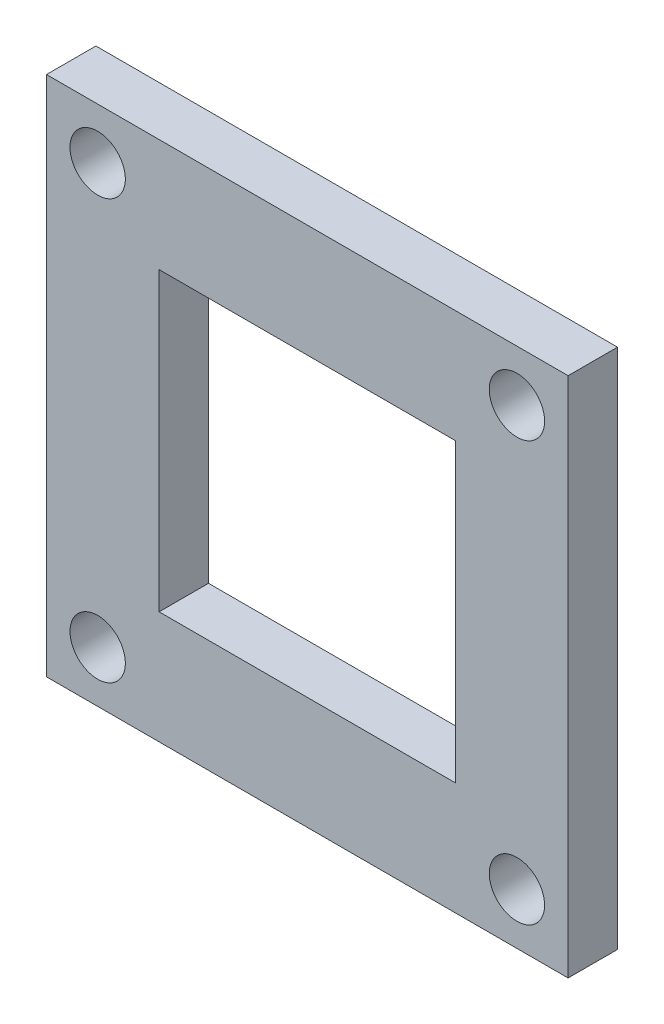
ISO-10303-21;
HEADER;
FILE_DESCRIPTION(('STEP AP214'),'2;1');
FILE_NAME('part.step','',(''),(''),'','','');
FILE_SCHEMA(('AUTOMOTIVE_DESIGN { 1 0 10303 214 1 1 1 1 }'));
ENDSEC;
DATA;
#1=APPLICATION_CONTEXT('core data for automotive mechanical design processes');
#2=APPLICATION_PROTOCOL_DEFINITION('international standard','automotive_design',2000,#1);
#3=PRODUCT_CONTEXT('',#1,'mechanical');
#4=PRODUCT('Part','Part','',(#3));
#5=PRODUCT_RELATED_PRODUCT_CATEGORY('part','',(#4));
#6=PRODUCT_DEFINITION_FORMATION('','',#4);
#7=PRODUCT_DEFINITION_CONTEXT('part definition',#1,'design');
#8=PRODUCT_DEFINITION('design','',#6,#7);
#9=PRODUCT_DEFINITION_SHAPE('','',#8);
#10=(LENGTH_UNIT() NAMED_UNIT(*) SI_UNIT(.MILLI.,.METRE.));
#11=(NAMED_UNIT(*) PLANE_ANGLE_UNIT() SI_UNIT($,.RADIAN.));
#12=(NAMED_UNIT(*) SI_UNIT($,.STERADIAN.) SOLID_ANGLE_UNIT());
#13=UNCERTAINTY_MEASURE_WITH_UNIT(LENGTH_MEASURE(1.E-05),#10,'distance_accuracy_value','');
#14=(GEOMETRIC_REPRESENTATION_CONTEXT(3) GLOBAL_UNCERTAINTY_ASSIGNED_CONTEXT((#13)) GLOBAL_UNIT_ASSIGNED_CONTEXT((#10,
#11,#12)) REPRESENTATION_CONTEXT('',''));
#15=CARTESIAN_POINT('',(0.,0.,0.));
#16=DIRECTION('',(0.,0.,1.));
#17=DIRECTION('',(1.,0.,0.));
#18=AXIS2_PLACEMENT_3D('',#15,#16,#17);
#19=CARTESIAN_POINT('',(0.,0.,3.175));
#20=DIRECTION('',(1.,0.,0.));
#21=DIRECTION('',(0.,0.,-1.));
#22=AXIS2_PLACEMENT_3D('',#19,#20,#21);
#23=PLANE('',#22);
#24=DIRECTION('',(0.,-1.,0.));
#25=VECTOR('',#24,1.);
#26=CARTESIAN_POINT('',(0.,0.,0.));
#27=LINE('',#26,#25);
#28=CARTESIAN_POINT('',(0.,33.528,0.));
#29=VERTEX_POINT('',#28);
#30=CARTESIAN_POINT('',(0.,0.,0.));
#31=VERTEX_POINT('',#30);
#32=EDGE_CURVE('E134',#29,#31,#27,.T.);
#33=ORIENTED_EDGE('',*,*,#32,.T.);
#34=DIRECTION('',(0.,0.,-1.));
#35=VECTOR('',#34,1.);
#36=CARTESIAN_POINT('',(0.,0.,3.175));
#37=LINE('',#36,#35);
#38=CARTESIAN_POINT('',(0.,0.,3.175));
#39=VERTEX_POINT('',#38);
#40=EDGE_CURVE('E11',#39,#31,#37,.T.);
#41=ORIENTED_EDGE('',*,*,#40,.F.);
#42=DIRECTION('',(0.,-1.,0.));
#43=VECTOR('',#42,1.);
#44=CARTESIAN_POINT('',(0.,0.,3.175));
#45=LINE('',#44,#43);
#46=CARTESIAN_POINT('',(0.,33.528,3.175));
#47=VERTEX_POINT('',#46);
#48=EDGE_CURVE('E138',#47,#39,#45,.T.);
#49=ORIENTED_EDGE('',*,*,#48,.F.);
#50=DIRECTION('',(0.,0.,-1.));
#51=VECTOR('',#50,1.);
#52=CARTESIAN_POINT('',(0.,33.528,3.175));
#53=LINE('',#52,#51);
#54=EDGE_CURVE('E148',#47,#29,#53,.T.);
#55=ORIENTED_EDGE('',*,*,#54,.T.);
#56=EDGE_LOOP('',(#33,#41,#49,#55));
#57=FACE_BOUND('',#56,.T.);
#58=ADVANCED_FACE('F33',(#57),#23,.F.);
#59=CARTESIAN_POINT('',(0.,0.,3.175));
#60=DIRECTION('',(0.,1.,0.));
#61=DIRECTION('',(0.,0.,1.));
#62=AXIS2_PLACEMENT_3D('',#59,#60,#61);
#63=PLANE('',#62);
#64=DIRECTION('',(1.,0.,0.));
#65=VECTOR('',#64,1.);
#66=CARTESIAN_POINT('',(0.,0.,0.));
#67=LINE('',#66,#65);
#68=CARTESIAN_POINT('',(33.528,0.,0.));
#69=VERTEX_POINT('',#68);
#70=EDGE_CURVE('E151',#31,#69,#67,.T.);
#71=ORIENTED_EDGE('',*,*,#70,.T.);
#72=DIRECTION('',(0.,0.,-1.));
#73=VECTOR('',#72,1.);
#74=CARTESIAN_POINT('',(33.528,0.,3.175));
#75=LINE('',#74,#73);
#76=CARTESIAN_POINT('',(33.528,0.,3.175));
#77=VERTEX_POINT('',#76);
#78=EDGE_CURVE('E40',#77,#69,#75,.T.);
#79=ORIENTED_EDGE('',*,*,#78,.F.);
#80=DIRECTION('',(1.,0.,0.));
#81=VECTOR('',#80,1.);
#82=CARTESIAN_POINT('',(0.,0.,3.175));
#83=LINE('',#82,#81);
#84=EDGE_CURVE('E141',#39,#77,#83,.T.);
#85=ORIENTED_EDGE('',*,*,#84,.F.);
#86=ORIENTED_EDGE('',*,*,#40,.T.);
#87=EDGE_LOOP('',(#71,#79,#85,#86));
#88=FACE_BOUND('',#87,.T.);
#89=ADVANCED_FACE('F179',(#88),#63,.F.);
#90=CARTESIAN_POINT('',(33.528,0.,3.175));
#91=DIRECTION('',(-1.,0.,0.));
#92=DIRECTION('',(0.,0.,1.));
#93=AXIS2_PLACEMENT_3D('',#90,#91,#92);
#94=PLANE('',#93);
#95=DIRECTION('',(0.,1.,0.));
#96=VECTOR('',#95,1.);
#97=CARTESIAN_POINT('',(33.528,0.,0.));
#98=LINE('',#97,#96);
#99=CARTESIAN_POINT('',(33.528,33.528,0.));
#100=VERTEX_POINT('',#99);
#101=EDGE_CURVE('E153',#69,#100,#98,.T.);
#102=ORIENTED_EDGE('',*,*,#101,.T.);
#103=DIRECTION('',(0.,0.,-1.));
#104=VECTOR('',#103,1.);
#105=CARTESIAN_POINT('',(33.528,33.528,3.175));
#106=LINE('',#105,#104);
#107=CARTESIAN_POINT('',(33.528,33.528,3.175));
#108=VERTEX_POINT('',#107);
#109=EDGE_CURVE('E158',#108,#100,#106,.T.);
#110=ORIENTED_EDGE('',*,*,#109,.F.);
#111=DIRECTION('',(0.,1.,0.));
#112=VECTOR('',#111,1.);
#113=CARTESIAN_POINT('',(33.528,0.,3.175));
#114=LINE('',#113,#112);
#115=EDGE_CURVE('E144',#77,#108,#114,.T.);
#116=ORIENTED_EDGE('',*,*,#115,.F.);
#117=ORIENTED_EDGE('',*,*,#78,.T.);
#118=EDGE_LOOP('',(#102,#110,#116,#117));
#119=FACE_BOUND('',#118,.T.);
#120=ADVANCED_FACE('F165',(#119),#94,.F.);
#121=CARTESIAN_POINT('',(0.,33.528,3.175));
#122=DIRECTION('',(0.,-1.,0.));
#123=DIRECTION('',(0.,0.,-1.));
#124=AXIS2_PLACEMENT_3D('',#121,#122,#123);
#125=PLANE('',#124);
#126=DIRECTION('',(-1.,0.,0.));
#127=VECTOR('',#126,1.);
#128=CARTESIAN_POINT('',(0.,33.528,0.));
#129=LINE('',#128,#127);
#130=EDGE_CURVE('E142',#100,#29,#129,.T.);
#131=ORIENTED_EDGE('',*,*,#130,.T.);
#132=ORIENTED_EDGE('',*,*,#54,.F.);
#133=DIRECTION('',(-1.,0.,0.));
#134=VECTOR('',#133,1.);
#135=CARTESIAN_POINT('',(0.,33.528,3.175));
#136=LINE('',#135,#134);
#137=EDGE_CURVE('E146',#108,#47,#136,.T.);
#138=ORIENTED_EDGE('',*,*,#137,.F.);
#139=ORIENTED_EDGE('',*,*,#109,.T.);
#140=EDGE_LOOP('',(#131,#132,#138,#139));
#141=FACE_BOUND('',#140,.T.);
#142=ADVANCED_FACE('F172',(#141),#125,.F.);
#143=CARTESIAN_POINT('',(0.,0.,3.175));
#144=DIRECTION('',(0.,0.,-1.));
#145=DIRECTION('',(-1.,0.,0.));
#146=AXIS2_PLACEMENT_3D('',#143,#144,#145);
#147=PLANE('',#146);
#148=CARTESIAN_POINT('',(3.2893,30.2387,3.175));
#149=DIRECTION('',(0.,0.,1.));
#150=DIRECTION('',(-1.,0.,0.));
#151=AXIS2_PLACEMENT_3D('',#148,#149,#150);
#152=CIRCLE('',#151,1.77799999999999);
#153=CARTESIAN_POINT('',(1.51130000000001,30.2387,3.175));
#154=VERTEX_POINT('',#153);
#155=EDGE_CURVE('E243',#154,#154,#152,.T.);
#156=ORIENTED_EDGE('',*,*,#155,.F.);
#157=EDGE_LOOP('',(#156));
#158=FACE_BOUND('',#157,.T.);
#159=CARTESIAN_POINT('',(3.2893,3.2893,3.175));
#160=DIRECTION('',(0.,0.,1.));
#161=DIRECTION('',(-1.,0.,0.));
#162=AXIS2_PLACEMENT_3D('',#159,#160,#161);
#163=CIRCLE('',#162,1.778);
#164=CARTESIAN_POINT('',(1.5113,3.2893,3.175));
#165=VERTEX_POINT('',#164);
#166=EDGE_CURVE('E235',#165,#165,#163,.T.);
#167=ORIENTED_EDGE('',*,*,#166,.F.);
#168=EDGE_LOOP('',(#167));
#169=FACE_BOUND('',#168,.T.);
#170=CARTESIAN_POINT('',(30.2387,3.2893,3.175));
#171=DIRECTION('',(0.,0.,1.));
#172=DIRECTION('',(1.,0.,0.));
#173=AXIS2_PLACEMENT_3D('',#170,#171,#172);
#174=CIRCLE('',#173,1.778);
#175=CARTESIAN_POINT('',(32.0167,3.2893,3.175));
#176=VERTEX_POINT('',#175);
#177=EDGE_CURVE('E229',#176,#176,#174,.T.);
#178=ORIENTED_EDGE('',*,*,#177,.F.);
#179=EDGE_LOOP('',(#178));
#180=FACE_BOUND('',#179,.T.);
#181=CARTESIAN_POINT('',(30.2387,30.2387,3.175));
#182=DIRECTION('',(0.,0.,1.));
#183=DIRECTION('',(1.,0.,0.));
#184=AXIS2_PLACEMENT_3D('',#181,#182,#183);
#185=CIRCLE('',#184,1.77799999999999);
#186=CARTESIAN_POINT('',(32.0167,30.2387,3.175));
#187=VERTEX_POINT('',#186);
#188=EDGE_CURVE('E121',#187,#187,#185,.T.);
#189=ORIENTED_EDGE('',*,*,#188,.F.);
#190=EDGE_LOOP('',(#189));
#191=FACE_BOUND('',#190,.T.);
#192=DIRECTION('',(1.,0.,0.));
#193=VECTOR('',#192,1.);
#194=CARTESIAN_POINT('',(7.23900000000001,7.239,3.175));
#195=LINE('',#194,#193);
#196=CARTESIAN_POINT('',(7.23900000000001,7.239,3.175));
#197=VERTEX_POINT('',#196);
#198=CARTESIAN_POINT('',(26.289,7.239,3.175));
#199=VERTEX_POINT('',#198);
#200=EDGE_CURVE('E127',#197,#199,#195,.T.);
#201=ORIENTED_EDGE('',*,*,#200,.F.);
#202=DIRECTION('',(0.,-1.,0.));
#203=VECTOR('',#202,1.);
#204=CARTESIAN_POINT('',(7.239,26.289,3.175));
#205=LINE('',#204,#203);
#206=CARTESIAN_POINT('',(7.239,26.289,3.175));
#207=VERTEX_POINT('',#206);
#208=EDGE_CURVE('E47',#207,#197,#205,.T.);
#209=ORIENTED_EDGE('',*,*,#208,.F.);
#210=DIRECTION('',(-1.,0.,0.));
#211=VECTOR('',#210,1.);
#212=CARTESIAN_POINT('',(7.239,26.289,3.175));
#213=LINE('',#212,#211);
#214=CARTESIAN_POINT('',(26.289,26.289,3.175));
#215=VERTEX_POINT('',#214);
#216=EDGE_CURVE('E115',#215,#207,#213,.T.);
#217=ORIENTED_EDGE('',*,*,#216,.F.);
#218=DIRECTION('',(0.,1.,0.));
#219=VECTOR('',#218,1.);
#220=CARTESIAN_POINT('',(26.289,26.289,3.175));
#221=LINE('',#220,#219);
#222=EDGE_CURVE('E118',#199,#215,#221,.T.);
#223=ORIENTED_EDGE('',*,*,#222,.F.);
#224=EDGE_LOOP('',(#201,#209,#217,#223));
#225=FACE_BOUND('',#224,.T.);
#226=ORIENTED_EDGE('',*,*,#48,.T.);
#227=ORIENTED_EDGE('',*,*,#84,.T.);
#228=ORIENTED_EDGE('',*,*,#115,.T.);
#229=ORIENTED_EDGE('',*,*,#137,.T.);
#230=EDGE_LOOP('',(#226,#227,#228,#229));
#231=FACE_BOUND('',#230,.T.);
#232=ADVANCED_FACE('F178',(#158,#169,#180,#191,#225,#231),#147,.F.);
#233=CARTESIAN_POINT('',(0.,0.,0.));
#234=DIRECTION('',(0.,0.,-1.));
#235=DIRECTION('',(-1.,0.,0.));
#236=AXIS2_PLACEMENT_3D('',#233,#234,#235);
#237=PLANE('',#236);
#238=CARTESIAN_POINT('',(3.2893,30.2387,0.));
#239=DIRECTION('',(0.,0.,1.));
#240=DIRECTION('',(-1.,0.,0.));
#241=AXIS2_PLACEMENT_3D('',#238,#239,#240);
#242=CIRCLE('',#241,1.77799999999999);
#243=CARTESIAN_POINT('',(1.51130000000001,30.2387,0.));
#244=VERTEX_POINT('',#243);
#245=EDGE_CURVE('E240',#244,#244,#242,.T.);
#246=ORIENTED_EDGE('',*,*,#245,.T.);
#247=EDGE_LOOP('',(#246));
#248=FACE_BOUND('',#247,.T.);
#249=CARTESIAN_POINT('',(3.2893,3.2893,0.));
#250=DIRECTION('',(0.,0.,1.));
#251=DIRECTION('',(-1.,0.,0.));
#252=AXIS2_PLACEMENT_3D('',#249,#250,#251);
#253=CIRCLE('',#252,1.778);
#254=CARTESIAN_POINT('',(1.5113,3.2893,0.));
#255=VERTEX_POINT('',#254);
#256=EDGE_CURVE('E231',#255,#255,#253,.T.);
#257=ORIENTED_EDGE('',*,*,#256,.T.);
#258=EDGE_LOOP('',(#257));
#259=FACE_BOUND('',#258,.T.);
#260=CARTESIAN_POINT('',(30.2387,3.2893,0.));
#261=DIRECTION('',(0.,0.,1.));
#262=DIRECTION('',(1.,0.,0.));
#263=AXIS2_PLACEMENT_3D('',#260,#261,#262);
#264=CIRCLE('',#263,1.778);
#265=CARTESIAN_POINT('',(32.0167,3.2893,0.));
#266=VERTEX_POINT('',#265);
#267=EDGE_CURVE('E226',#266,#266,#264,.T.);
#268=ORIENTED_EDGE('',*,*,#267,.T.);
#269=EDGE_LOOP('',(#268));
#270=FACE_BOUND('',#269,.T.);
#271=CARTESIAN_POINT('',(30.2387,30.2387,0.));
#272=DIRECTION('',(0.,0.,1.));
#273=DIRECTION('',(1.,0.,0.));
#274=AXIS2_PLACEMENT_3D('',#271,#272,#273);
#275=CIRCLE('',#274,1.77799999999999);
#276=CARTESIAN_POINT('',(32.0167,30.2387,0.));
#277=VERTEX_POINT('',#276);
#278=EDGE_CURVE('E128',#277,#277,#275,.T.);
#279=ORIENTED_EDGE('',*,*,#278,.T.);
#280=EDGE_LOOP('',(#279));
#281=FACE_BOUND('',#280,.T.);
#282=DIRECTION('',(0.,-1.,0.));
#283=VECTOR('',#282,1.);
#284=CARTESIAN_POINT('',(7.239,26.289,0.));
#285=LINE('',#284,#283);
#286=CARTESIAN_POINT('',(7.239,26.289,0.));
#287=VERTEX_POINT('',#286);
#288=CARTESIAN_POINT('',(7.23900000000001,7.239,0.));
#289=VERTEX_POINT('',#288);
#290=EDGE_CURVE('E99',#287,#289,#285,.T.);
#291=ORIENTED_EDGE('',*,*,#290,.T.);
#292=DIRECTION('',(1.,0.,0.));
#293=VECTOR('',#292,1.);
#294=CARTESIAN_POINT('',(7.23900000000001,7.239,0.));
#295=LINE('',#294,#293);
#296=CARTESIAN_POINT('',(26.289,7.239,0.));
#297=VERTEX_POINT('',#296);
#298=EDGE_CURVE('E108',#289,#297,#295,.T.);
#299=ORIENTED_EDGE('',*,*,#298,.T.);
#300=DIRECTION('',(0.,1.,0.));
#301=VECTOR('',#300,1.);
#302=CARTESIAN_POINT('',(26.289,26.289,0.));
#303=LINE('',#302,#301);
#304=CARTESIAN_POINT('',(26.289,26.289,0.));
#305=VERTEX_POINT('',#304);
#306=EDGE_CURVE('E55',#297,#305,#303,.T.);
#307=ORIENTED_EDGE('',*,*,#306,.T.);
#308=DIRECTION('',(-1.,0.,0.));
#309=VECTOR('',#308,1.);
#310=CARTESIAN_POINT('',(7.239,26.289,0.));
#311=LINE('',#310,#309);
#312=EDGE_CURVE('E105',#305,#287,#311,.T.);
#313=ORIENTED_EDGE('',*,*,#312,.T.);
#314=EDGE_LOOP('',(#291,#299,#307,#313));
#315=FACE_BOUND('',#314,.T.);
#316=ORIENTED_EDGE('',*,*,#32,.F.);
#317=ORIENTED_EDGE('',*,*,#130,.F.);
#318=ORIENTED_EDGE('',*,*,#101,.F.);
#319=ORIENTED_EDGE('',*,*,#70,.F.);
#320=EDGE_LOOP('',(#316,#317,#318,#319));
#321=FACE_BOUND('',#320,.T.);
#322=ADVANCED_FACE('F112',(#248,#259,#270,#281,#315,#321),#237,.T.);
#323=CARTESIAN_POINT('',(7.239,26.289,0.));
#324=DIRECTION('',(-1.,0.,0.));
#325=DIRECTION('',(0.,-1.,0.));
#326=AXIS2_PLACEMENT_3D('',#323,#324,#325);
#327=PLANE('',#326);
#328=ORIENTED_EDGE('',*,*,#208,.T.);
#329=DIRECTION('',(0.,0.,1.));
#330=VECTOR('',#329,1.);
#331=CARTESIAN_POINT('',(7.23900000000001,7.239,0.));
#332=LINE('',#331,#330);
#333=EDGE_CURVE('E95',#289,#197,#332,.T.);
#334=ORIENTED_EDGE('',*,*,#333,.F.);
#335=ORIENTED_EDGE('',*,*,#290,.F.);
#336=DIRECTION('',(0.,0.,1.));
#337=VECTOR('',#336,1.);
#338=CARTESIAN_POINT('',(7.239,26.289,0.));
#339=LINE('',#338,#337);
#340=EDGE_CURVE('E132',#287,#207,#339,.T.);
#341=ORIENTED_EDGE('',*,*,#340,.T.);
#342=EDGE_LOOP('',(#328,#334,#335,#341));
#343=FACE_BOUND('',#342,.T.);
#344=ADVANCED_FACE('F97',(#343),#327,.F.);
#345=CARTESIAN_POINT('',(7.239,26.289,0.));
#346=DIRECTION('',(0.,1.,0.));
#347=DIRECTION('',(0.,0.,1.));
#348=AXIS2_PLACEMENT_3D('',#345,#346,#347);
#349=PLANE('',#348);
#350=ORIENTED_EDGE('',*,*,#216,.T.);
#351=ORIENTED_EDGE('',*,*,#340,.F.);
#352=ORIENTED_EDGE('',*,*,#312,.F.);
#353=DIRECTION('',(0.,0.,1.));
#354=VECTOR('',#353,1.);
#355=CARTESIAN_POINT('',(26.289,26.289,0.));
#356=LINE('',#355,#354);
#357=EDGE_CURVE('E135',#305,#215,#356,.T.);
#358=ORIENTED_EDGE('',*,*,#357,.T.);
#359=EDGE_LOOP('',(#350,#351,#352,#358));
#360=FACE_BOUND('',#359,.T.);
#361=ADVANCED_FACE('F197',(#360),#349,.F.);
#362=CARTESIAN_POINT('',(26.289,26.289,0.));
#363=DIRECTION('',(1.,0.,0.));
#364=DIRECTION('',(0.,1.,0.));
#365=AXIS2_PLACEMENT_3D('',#362,#363,#364);
#366=PLANE('',#365);
#367=ORIENTED_EDGE('',*,*,#222,.T.);
#368=ORIENTED_EDGE('',*,*,#357,.F.);
#369=ORIENTED_EDGE('',*,*,#306,.F.);
#370=DIRECTION('',(0.,0.,1.));
#371=VECTOR('',#370,1.);
#372=CARTESIAN_POINT('',(26.289,7.239,0.));
#373=LINE('',#372,#371);
#374=EDGE_CURVE('E104',#297,#199,#373,.T.);
#375=ORIENTED_EDGE('',*,*,#374,.T.);
#376=EDGE_LOOP('',(#367,#368,#369,#375));
#377=FACE_BOUND('',#376,.T.);
#378=ADVANCED_FACE('F201',(#377),#366,.F.);
#379=CARTESIAN_POINT('',(7.23900000000001,7.239,0.));
#380=DIRECTION('',(0.,-1.,0.));
#381=DIRECTION('',(1.,0.,0.));
#382=AXIS2_PLACEMENT_3D('',#379,#380,#381);
#383=PLANE('',#382);
#384=ORIENTED_EDGE('',*,*,#200,.T.);
#385=ORIENTED_EDGE('',*,*,#374,.F.);
#386=ORIENTED_EDGE('',*,*,#298,.F.);
#387=ORIENTED_EDGE('',*,*,#333,.T.);
#388=EDGE_LOOP('',(#384,#385,#386,#387));
#389=FACE_BOUND('',#388,.T.);
#390=ADVANCED_FACE('F109',(#389),#383,.F.);
#391=CARTESIAN_POINT('',(30.2387,30.2387,0.));
#392=DIRECTION('',(0.,0.,1.));
#393=DIRECTION('',(1.,0.,0.));
#394=AXIS2_PLACEMENT_3D('',#391,#392,#393);
#395=CYLINDRICAL_SURFACE('',#394,1.77799999999999);
#396=ORIENTED_EDGE('',*,*,#278,.F.);
#397=EDGE_LOOP('',(#396));
#398=FACE_BOUND('',#397,.T.);
#399=ORIENTED_EDGE('',*,*,#188,.T.);
#400=EDGE_LOOP('',(#399));
#401=FACE_BOUND('',#400,.T.);
#402=ADVANCED_FACE('F200',(#398,#401),#395,.F.);
#403=CARTESIAN_POINT('',(30.2387,3.2893,0.));
#404=DIRECTION('',(0.,0.,1.));
#405=DIRECTION('',(1.,0.,0.));
#406=AXIS2_PLACEMENT_3D('',#403,#404,#405);
#407=CYLINDRICAL_SURFACE('',#406,1.778);
#408=ORIENTED_EDGE('',*,*,#267,.F.);
#409=EDGE_LOOP('',(#408));
#410=FACE_BOUND('',#409,.T.);
#411=ORIENTED_EDGE('',*,*,#177,.T.);
#412=EDGE_LOOP('',(#411));
#413=FACE_BOUND('',#412,.T.);
#414=ADVANCED_FACE('F209',(#410,#413),#407,.F.);
#415=CARTESIAN_POINT('',(3.2893,3.2893,0.));
#416=DIRECTION('',(0.,0.,1.));
#417=DIRECTION('',(1.,0.,0.));
#418=AXIS2_PLACEMENT_3D('',#415,#416,#417);
#419=CYLINDRICAL_SURFACE('',#418,1.778);
#420=ORIENTED_EDGE('',*,*,#256,.F.);
#421=EDGE_LOOP('',(#420));
#422=FACE_BOUND('',#421,.T.);
#423=ORIENTED_EDGE('',*,*,#166,.T.);
#424=EDGE_LOOP('',(#423));
#425=FACE_BOUND('',#424,.T.);
#426=ADVANCED_FACE('F214',(#422,#425),#419,.F.);
#427=CARTESIAN_POINT('',(3.2893,30.2387,0.));
#428=DIRECTION('',(0.,0.,1.));
#429=DIRECTION('',(1.,0.,0.));
#430=AXIS2_PLACEMENT_3D('',#427,#428,#429);
#431=CYLINDRICAL_SURFACE('',#430,1.77799999999999);
#432=ORIENTED_EDGE('',*,*,#245,.F.);
#433=EDGE_LOOP('',(#432));
#434=FACE_BOUND('',#433,.T.);
#435=ORIENTED_EDGE('',*,*,#155,.T.);
#436=EDGE_LOOP('',(#435));
#437=FACE_BOUND('',#436,.T.);
#438=ADVANCED_FACE('F211',(#434,#437),#431,.F.);
#439=CLOSED_SHELL('',(#58,#89,#120,#142,#232,#322,#344,#361,#378,#390,#402,#414,#426,#438));
#440=MANIFOLD_SOLID_BREP('B2',#439);
#441=ADVANCED_BREP_SHAPE_REPRESENTATION('',(#18,#440),#14);
#442=SHAPE_DEFINITION_REPRESENTATION(#9,#441);
ENDSEC;
END-ISO-10303-21;
